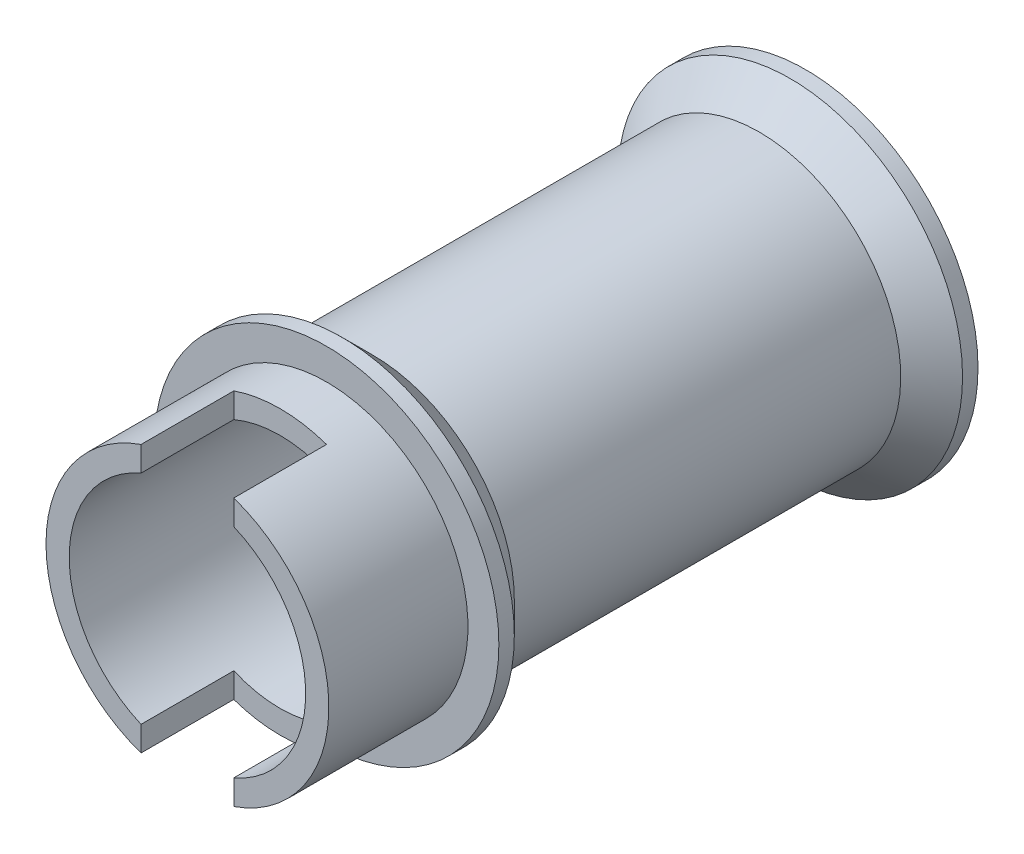
ISO-10303-21;
HEADER;
FILE_DESCRIPTION(('STEP AP214'),'2;1');
FILE_NAME('part.step','',(''),(''),'','','');
FILE_SCHEMA(('AUTOMOTIVE_DESIGN { 1 0 10303 214 1 1 1 1 }'));
ENDSEC;
DATA;
#1=APPLICATION_CONTEXT('core data for automotive mechanical design processes');
#2=APPLICATION_PROTOCOL_DEFINITION('international standard','automotive_design',2000,#1);
#3=PRODUCT_CONTEXT('',#1,'mechanical');
#4=PRODUCT('Part','Part','',(#3));
#5=PRODUCT_RELATED_PRODUCT_CATEGORY('part','',(#4));
#6=PRODUCT_DEFINITION_FORMATION('','',#4);
#7=PRODUCT_DEFINITION_CONTEXT('part definition',#1,'design');
#8=PRODUCT_DEFINITION('design','',#6,#7);
#9=PRODUCT_DEFINITION_SHAPE('','',#8);
#10=(LENGTH_UNIT() NAMED_UNIT(*) SI_UNIT(.MILLI.,.METRE.));
#11=(NAMED_UNIT(*) PLANE_ANGLE_UNIT() SI_UNIT($,.RADIAN.));
#12=(NAMED_UNIT(*) SI_UNIT($,.STERADIAN.) SOLID_ANGLE_UNIT());
#13=UNCERTAINTY_MEASURE_WITH_UNIT(LENGTH_MEASURE(1.E-05),#10,'distance_accuracy_value','');
#14=(GEOMETRIC_REPRESENTATION_CONTEXT(3) GLOBAL_UNCERTAINTY_ASSIGNED_CONTEXT((#13)) GLOBAL_UNIT_ASSIGNED_CONTEXT((#10,
#11,#12)) REPRESENTATION_CONTEXT('',''));
#15=CARTESIAN_POINT('',(0.,0.,0.));
#16=DIRECTION('',(0.,0.,1.));
#17=DIRECTION('',(1.,0.,0.));
#18=AXIS2_PLACEMENT_3D('',#15,#16,#17);
#19=CARTESIAN_POINT('',(0.,0.,40.));
#20=DIRECTION('',(0.,0.,-1.));
#21=DIRECTION('',(-1.,0.,0.));
#22=AXIS2_PLACEMENT_3D('',#19,#20,#21);
#23=CYLINDRICAL_SURFACE('',#22,9.15);
#24=DIRECTION('',(0.,0.,-1.));
#25=VECTOR('',#24,1.);
#26=CARTESIAN_POINT('',(0.499999999999999,-9.13632858428373,5.));
#27=LINE('',#26,#25);
#28=CARTESIAN_POINT('',(0.499999999999999,-9.13632858428374,2.99999999999998));
#29=VERTEX_POINT('',#28);
#30=CARTESIAN_POINT('',(0.499999999999999,-9.13632858428373,0.));
#31=VERTEX_POINT('',#30);
#32=EDGE_CURVE('E129',#29,#31,#27,.T.);
#33=ORIENTED_EDGE('',*,*,#32,.F.);
#34=CARTESIAN_POINT('',(0.,0.,3.));
#35=DIRECTION('',(0.,0.,-1.));
#36=DIRECTION('',(-1.,0.,0.));
#37=AXIS2_PLACEMENT_3D('',#34,#35,#36);
#38=CIRCLE('',#37,9.15);
#39=CARTESIAN_POINT('',(-0.500000000000001,-9.13632858428373,2.99999999999999));
#40=VERTEX_POINT('',#39);
#41=EDGE_CURVE('E247',#40,#29,#38,.T.);
#42=ORIENTED_EDGE('',*,*,#41,.F.);
#43=DIRECTION('',(0.,0.,-1.));
#44=VECTOR('',#43,1.);
#45=CARTESIAN_POINT('',(-0.500000000000001,-9.13632858428373,5.));
#46=LINE('',#45,#44);
#47=CARTESIAN_POINT('',(-0.500000000000001,-9.13632858428373,0.));
#48=VERTEX_POINT('',#47);
#49=EDGE_CURVE('E143',#40,#48,#46,.T.);
#50=ORIENTED_EDGE('',*,*,#49,.T.);
#51=CARTESIAN_POINT('',(0.,0.,0.));
#52=DIRECTION('',(0.,0.,1.));
#53=DIRECTION('',(1.,0.,0.));
#54=AXIS2_PLACEMENT_3D('',#51,#52,#53);
#55=CIRCLE('',#54,9.15);
#56=EDGE_CURVE('E141',#48,#31,#55,.T.);
#57=ORIENTED_EDGE('',*,*,#56,.T.);
#58=EDGE_LOOP('',(#33,#42,#50,#57));
#59=FACE_BOUND('',#58,.T.);
#60=CARTESIAN_POINT('',(0.,0.,28.));
#61=DIRECTION('',(0.,0.,1.));
#62=DIRECTION('',(1.,0.,0.));
#63=AXIS2_PLACEMENT_3D('',#60,#61,#62);
#64=CIRCLE('',#63,9.15);
#65=CARTESIAN_POINT('',(9.15,0.,28.));
#66=VERTEX_POINT('',#65);
#67=EDGE_CURVE('E243',#66,#66,#64,.T.);
#68=ORIENTED_EDGE('',*,*,#67,.F.);
#69=EDGE_LOOP('',(#68));
#70=FACE_BOUND('',#69,.T.);
#71=ADVANCED_FACE('F41',(#59,#70),#23,.T.);
#72=CARTESIAN_POINT('',(0.,0.,34.));
#73=DIRECTION('',(0.,0.,-1.));
#74=DIRECTION('',(-1.,0.,0.));
#75=AXIS2_PLACEMENT_3D('',#72,#73,#74);
#76=CIRCLE('',#75,9.15);
#77=CARTESIAN_POINT('',(3.,-8.64421772053435,34.));
#78=VERTEX_POINT('',#77);
#79=CARTESIAN_POINT('',(-3.,-8.64421772053435,34.));
#80=VERTEX_POINT('',#79);
#81=EDGE_CURVE('E196',#78,#80,#76,.T.);
#82=ORIENTED_EDGE('',*,*,#81,.T.);
#83=DIRECTION('',(0.,0.,-1.));
#84=VECTOR('',#83,1.);
#85=CARTESIAN_POINT('',(-3.,-8.64421772053435,40.));
#86=LINE('',#85,#84);
#87=CARTESIAN_POINT('',(-3.,-8.64421772053435,40.));
#88=VERTEX_POINT('',#87);
#89=EDGE_CURVE('E201',#80,#88,#86,.F.);
#90=ORIENTED_EDGE('',*,*,#89,.T.);
#91=CARTESIAN_POINT('',(0.,0.,40.));
#92=DIRECTION('',(0.,0.,1.));
#93=DIRECTION('',(1.,0.,0.));
#94=AXIS2_PLACEMENT_3D('',#91,#92,#93);
#95=CIRCLE('',#94,9.15);
#96=CARTESIAN_POINT('',(-3.,8.64421772053435,40.));
#97=VERTEX_POINT('',#96);
#98=EDGE_CURVE('E222',#97,#88,#95,.T.);
#99=ORIENTED_EDGE('',*,*,#98,.F.);
#100=DIRECTION('',(0.,0.,-1.));
#101=VECTOR('',#100,1.);
#102=CARTESIAN_POINT('',(-3.,8.64421772053435,40.));
#103=LINE('',#102,#101);
#104=CARTESIAN_POINT('',(-3.,8.64421772053435,34.));
#105=VERTEX_POINT('',#104);
#106=EDGE_CURVE('E205',#97,#105,#103,.T.);
#107=ORIENTED_EDGE('',*,*,#106,.T.);
#108=CARTESIAN_POINT('',(3.,8.64421772053435,34.));
#109=VERTEX_POINT('',#108);
#110=EDGE_CURVE('E200',#105,#109,#76,.T.);
#111=ORIENTED_EDGE('',*,*,#110,.T.);
#112=DIRECTION('',(0.,0.,-1.));
#113=VECTOR('',#112,1.);
#114=CARTESIAN_POINT('',(3.,8.64421772053435,40.));
#115=LINE('',#114,#113);
#116=CARTESIAN_POINT('',(3.,8.64421772053435,40.));
#117=VERTEX_POINT('',#116);
#118=EDGE_CURVE('E188',#109,#117,#115,.F.);
#119=ORIENTED_EDGE('',*,*,#118,.T.);
#120=CARTESIAN_POINT('',(3.,-8.64421772053435,40.));
#121=VERTEX_POINT('',#120);
#122=EDGE_CURVE('E218',#121,#117,#95,.T.);
#123=ORIENTED_EDGE('',*,*,#122,.F.);
#124=DIRECTION('',(0.,0.,-1.));
#125=VECTOR('',#124,1.);
#126=CARTESIAN_POINT('',(3.,-8.64421772053435,40.));
#127=LINE('',#126,#125);
#128=EDGE_CURVE('E192',#121,#78,#127,.T.);
#129=ORIENTED_EDGE('',*,*,#128,.T.);
#130=EDGE_LOOP('',(#82,#90,#99,#107,#111,#119,#123,#129));
#131=FACE_BOUND('',#130,.T.);
#132=CARTESIAN_POINT('',(0.,0.,31.));
#133=DIRECTION('',(0.,0.,-1.));
#134=DIRECTION('',(-1.,0.,0.));
#135=AXIS2_PLACEMENT_3D('',#132,#133,#134);
#136=CIRCLE('',#135,9.15);
#137=CARTESIAN_POINT('',(-9.15,0.,31.));
#138=VERTEX_POINT('',#137);
#139=EDGE_CURVE('E239',#138,#138,#136,.T.);
#140=ORIENTED_EDGE('',*,*,#139,.F.);
#141=EDGE_LOOP('',(#140));
#142=FACE_BOUND('',#141,.T.);
#143=ADVANCED_FACE('F291',(#131,#142),#23,.T.);
#144=CARTESIAN_POINT('',(0.,0.,40.));
#145=DIRECTION('',(0.,0.,1.));
#146=DIRECTION('',(1.,0.,0.));
#147=AXIS2_PLACEMENT_3D('',#144,#145,#146);
#148=PLANE('',#147);
#149=DIRECTION('',(0.,1.,0.));
#150=VECTOR('',#149,1.);
#151=CARTESIAN_POINT('',(-3.,-15.,40.));
#152=LINE('',#151,#150);
#153=CARTESIAN_POINT('',(-3.,7.03722246344394,40.));
#154=VERTEX_POINT('',#153);
#155=EDGE_CURVE('E171',#154,#97,#152,.T.);
#156=ORIENTED_EDGE('',*,*,#155,.T.);
#157=ORIENTED_EDGE('',*,*,#98,.T.);
#158=CARTESIAN_POINT('',(-3.,-7.03722246344394,40.));
#159=VERTEX_POINT('',#158);
#160=EDGE_CURVE('E184',#88,#159,#152,.T.);
#161=ORIENTED_EDGE('',*,*,#160,.T.);
#162=CARTESIAN_POINT('',(0.,0.,40.));
#163=DIRECTION('',(0.,0.,1.));
#164=DIRECTION('',(1.,0.,0.));
#165=AXIS2_PLACEMENT_3D('',#162,#163,#164);
#166=CIRCLE('',#165,7.65);
#167=EDGE_CURVE('E214',#154,#159,#166,.T.);
#168=ORIENTED_EDGE('',*,*,#167,.F.);
#169=EDGE_LOOP('',(#156,#157,#161,#168));
#170=FACE_BOUND('',#169,.T.);
#171=ADVANCED_FACE('F274',(#170),#148,.T.);
#172=DIRECTION('',(0.,1.,0.));
#173=VECTOR('',#172,1.);
#174=CARTESIAN_POINT('',(3.,-15.,40.));
#175=LINE('',#174,#173);
#176=CARTESIAN_POINT('',(3.,-7.03722246344394,40.));
#177=VERTEX_POINT('',#176);
#178=EDGE_CURVE('E180',#121,#177,#175,.T.);
#179=ORIENTED_EDGE('',*,*,#178,.F.);
#180=ORIENTED_EDGE('',*,*,#122,.T.);
#181=CARTESIAN_POINT('',(3.,7.03722246344394,40.));
#182=VERTEX_POINT('',#181);
#183=EDGE_CURVE('E181',#182,#117,#175,.T.);
#184=ORIENTED_EDGE('',*,*,#183,.F.);
#185=EDGE_CURVE('E210',#177,#182,#166,.T.);
#186=ORIENTED_EDGE('',*,*,#185,.F.);
#187=EDGE_LOOP('',(#179,#180,#184,#186));
#188=FACE_BOUND('',#187,.T.);
#189=ADVANCED_FACE('F305',(#188),#148,.T.);
#190=CARTESIAN_POINT('',(0.,0.,0.));
#191=DIRECTION('',(0.,0.,1.));
#192=DIRECTION('',(1.,0.,0.));
#193=AXIS2_PLACEMENT_3D('',#190,#191,#192);
#194=PLANE('',#193);
#195=CARTESIAN_POINT('',(0.,0.,0.));
#196=DIRECTION('',(0.,0.,1.));
#197=DIRECTION('',(1.,0.,0.));
#198=AXIS2_PLACEMENT_3D('',#195,#196,#197);
#199=CIRCLE('',#198,7.65);
#200=CARTESIAN_POINT('',(7.65,0.,0.));
#201=VERTEX_POINT('',#200);
#202=EDGE_CURVE('E209',#201,#201,#199,.T.);
#203=ORIENTED_EDGE('',*,*,#202,.T.);
#204=EDGE_LOOP('',(#203));
#205=FACE_BOUND('',#204,.T.);
#206=ORIENTED_EDGE('',*,*,#56,.F.);
#207=DIRECTION('',(0.0546448087431694,0.998505856205873,0.));
#208=VECTOR('',#207,1.);
#209=CARTESIAN_POINT('',(-0.500000000000001,-9.13632858428373,0.));
#210=LINE('',#209,#208);
#211=CARTESIAN_POINT('',(-0.60928961748634,-11.1333402966955,0.));
#212=VERTEX_POINT('',#211);
#213=EDGE_CURVE('E138',#212,#48,#210,.T.);
#214=ORIENTED_EDGE('',*,*,#213,.F.);
#215=CARTESIAN_POINT('',(0.,0.,0.));
#216=DIRECTION('',(0.,0.,-1.));
#217=DIRECTION('',(-1.,0.,0.));
#218=AXIS2_PLACEMENT_3D('',#215,#216,#217);
#219=CIRCLE('',#218,11.15);
#220=CARTESIAN_POINT('',(0.609289617486333,-11.1333402966955,0.));
#221=VERTEX_POINT('',#220);
#222=EDGE_CURVE('E152',#212,#221,#219,.T.);
#223=ORIENTED_EDGE('',*,*,#222,.T.);
#224=DIRECTION('',(0.0546448087431692,-0.998505856205873,0.));
#225=VECTOR('',#224,1.);
#226=CARTESIAN_POINT('',(0.609289617486337,-11.1333402966955,0.));
#227=LINE('',#226,#225);
#228=EDGE_CURVE('E133',#31,#221,#227,.T.);
#229=ORIENTED_EDGE('',*,*,#228,.F.);
#230=EDGE_LOOP('',(#206,#214,#223,#229));
#231=FACE_BOUND('',#230,.T.);
#232=ADVANCED_FACE('F150',(#205,#231),#194,.F.);
#233=CARTESIAN_POINT('',(0.,0.,40.));
#234=DIRECTION('',(0.,0.,-1.));
#235=DIRECTION('',(-1.,0.,0.));
#236=AXIS2_PLACEMENT_3D('',#233,#234,#235);
#237=CYLINDRICAL_SURFACE('',#236,7.65);
#238=DIRECTION('',(0.,0.,-1.));
#239=VECTOR('',#238,1.);
#240=CARTESIAN_POINT('',(-3.,-7.03722246344394,40.));
#241=LINE('',#240,#239);
#242=CARTESIAN_POINT('',(-3.,-7.03722246344394,34.));
#243=VERTEX_POINT('',#242);
#244=EDGE_CURVE('E236',#243,#159,#241,.F.);
#245=ORIENTED_EDGE('',*,*,#244,.F.);
#246=CARTESIAN_POINT('',(0.,0.,34.));
#247=DIRECTION('',(0.,0.,-1.));
#248=DIRECTION('',(-1.,0.,0.));
#249=AXIS2_PLACEMENT_3D('',#246,#247,#248);
#250=CIRCLE('',#249,7.65);
#251=CARTESIAN_POINT('',(3.,-7.03722246344394,34.));
#252=VERTEX_POINT('',#251);
#253=EDGE_CURVE('E230',#252,#243,#250,.T.);
#254=ORIENTED_EDGE('',*,*,#253,.F.);
#255=DIRECTION('',(0.,0.,-1.));
#256=VECTOR('',#255,1.);
#257=CARTESIAN_POINT('',(3.,-7.03722246344394,40.));
#258=LINE('',#257,#256);
#259=EDGE_CURVE('E233',#177,#252,#258,.T.);
#260=ORIENTED_EDGE('',*,*,#259,.F.);
#261=ORIENTED_EDGE('',*,*,#185,.T.);
#262=DIRECTION('',(0.,0.,-1.));
#263=VECTOR('',#262,1.);
#264=CARTESIAN_POINT('',(3.,7.03722246344394,40.));
#265=LINE('',#264,#263);
#266=CARTESIAN_POINT('',(3.,7.03722246344394,34.));
#267=VERTEX_POINT('',#266);
#268=EDGE_CURVE('E223',#267,#182,#265,.F.);
#269=ORIENTED_EDGE('',*,*,#268,.F.);
#270=CARTESIAN_POINT('',(-3.,7.03722246344394,34.));
#271=VERTEX_POINT('',#270);
#272=EDGE_CURVE('E226',#271,#267,#250,.T.);
#273=ORIENTED_EDGE('',*,*,#272,.F.);
#274=DIRECTION('',(0.,0.,-1.));
#275=VECTOR('',#274,1.);
#276=CARTESIAN_POINT('',(-3.,7.03722246344394,40.));
#277=LINE('',#276,#275);
#278=EDGE_CURVE('E229',#154,#271,#277,.T.);
#279=ORIENTED_EDGE('',*,*,#278,.F.);
#280=ORIENTED_EDGE('',*,*,#167,.T.);
#281=EDGE_LOOP('',(#245,#254,#260,#261,#269,#273,#279,#280));
#282=FACE_BOUND('',#281,.T.);
#283=ORIENTED_EDGE('',*,*,#202,.F.);
#284=EDGE_LOOP('',(#283));
#285=FACE_BOUND('',#284,.T.);
#286=ADVANCED_FACE('F280',(#282,#285),#237,.F.);
#287=CARTESIAN_POINT('',(3.,-15.,40.));
#288=DIRECTION('',(1.,0.,0.));
#289=DIRECTION('',(0.,0.,-1.));
#290=AXIS2_PLACEMENT_3D('',#287,#288,#289);
#291=PLANE('',#290);
#292=DIRECTION('',(0.,1.,0.));
#293=VECTOR('',#292,1.);
#294=CARTESIAN_POINT('',(3.,-15.,34.));
#295=LINE('',#294,#293);
#296=EDGE_CURVE('E66',#267,#109,#295,.T.);
#297=ORIENTED_EDGE('',*,*,#296,.F.);
#298=ORIENTED_EDGE('',*,*,#268,.T.);
#299=ORIENTED_EDGE('',*,*,#183,.T.);
#300=ORIENTED_EDGE('',*,*,#118,.F.);
#301=EDGE_LOOP('',(#297,#298,#299,#300));
#302=FACE_BOUND('',#301,.T.);
#303=ADVANCED_FACE('F306',(#302),#291,.F.);
#304=CARTESIAN_POINT('',(-3.,-15.,34.));
#305=DIRECTION('',(0.,0.,-1.));
#306=DIRECTION('',(-1.,0.,0.));
#307=AXIS2_PLACEMENT_3D('',#304,#305,#306);
#308=PLANE('',#307);
#309=DIRECTION('',(0.,1.,0.));
#310=VECTOR('',#309,1.);
#311=CARTESIAN_POINT('',(-3.,-15.,34.));
#312=LINE('',#311,#310);
#313=EDGE_CURVE('E172',#271,#105,#312,.T.);
#314=ORIENTED_EDGE('',*,*,#313,.F.);
#315=ORIENTED_EDGE('',*,*,#272,.T.);
#316=ORIENTED_EDGE('',*,*,#296,.T.);
#317=ORIENTED_EDGE('',*,*,#110,.F.);
#318=EDGE_LOOP('',(#314,#315,#316,#317));
#319=FACE_BOUND('',#318,.T.);
#320=ADVANCED_FACE('F289',(#319),#308,.F.);
#321=CARTESIAN_POINT('',(-3.,-15.,40.));
#322=DIRECTION('',(-1.,0.,0.));
#323=DIRECTION('',(0.,0.,1.));
#324=AXIS2_PLACEMENT_3D('',#321,#322,#323);
#325=PLANE('',#324);
#326=ORIENTED_EDGE('',*,*,#155,.F.);
#327=ORIENTED_EDGE('',*,*,#278,.T.);
#328=ORIENTED_EDGE('',*,*,#313,.T.);
#329=ORIENTED_EDGE('',*,*,#106,.F.);
#330=EDGE_LOOP('',(#326,#327,#328,#329));
#331=FACE_BOUND('',#330,.T.);
#332=ADVANCED_FACE('F287',(#331),#325,.F.);
#333=EDGE_CURVE('E176',#80,#243,#312,.T.);
#334=ORIENTED_EDGE('',*,*,#333,.T.);
#335=ORIENTED_EDGE('',*,*,#244,.T.);
#336=ORIENTED_EDGE('',*,*,#160,.F.);
#337=ORIENTED_EDGE('',*,*,#89,.F.);
#338=EDGE_LOOP('',(#334,#335,#336,#337));
#339=FACE_BOUND('',#338,.T.);
#340=ADVANCED_FACE('F295',(#339),#325,.F.);
#341=EDGE_CURVE('E177',#78,#252,#295,.T.);
#342=ORIENTED_EDGE('',*,*,#341,.T.);
#343=ORIENTED_EDGE('',*,*,#253,.T.);
#344=ORIENTED_EDGE('',*,*,#333,.F.);
#345=ORIENTED_EDGE('',*,*,#81,.F.);
#346=EDGE_LOOP('',(#342,#343,#344,#345));
#347=FACE_BOUND('',#346,.T.);
#348=ADVANCED_FACE('F297',(#347),#308,.F.);
#349=ORIENTED_EDGE('',*,*,#178,.T.);
#350=ORIENTED_EDGE('',*,*,#259,.T.);
#351=ORIENTED_EDGE('',*,*,#341,.F.);
#352=ORIENTED_EDGE('',*,*,#128,.F.);
#353=EDGE_LOOP('',(#349,#350,#351,#352));
#354=FACE_BOUND('',#353,.T.);
#355=ADVANCED_FACE('F309',(#354),#291,.F.);
#356=CARTESIAN_POINT('',(0.,0.,0.));
#357=DIRECTION('',(0.,0.,-1.));
#358=DIRECTION('',(-1.,0.,0.));
#359=AXIS2_PLACEMENT_3D('',#356,#357,#358);
#360=CYLINDRICAL_SURFACE('',#359,11.15);
#361=CARTESIAN_POINT('',(0.,0.,30.));
#362=DIRECTION('',(0.,0.,1.));
#363=DIRECTION('',(1.,0.,0.));
#364=AXIS2_PLACEMENT_3D('',#361,#362,#363);
#365=CIRCLE('',#364,11.15);
#366=CARTESIAN_POINT('',(11.15,0.,30.));
#367=VERTEX_POINT('',#366);
#368=EDGE_CURVE('E254',#367,#367,#365,.T.);
#369=ORIENTED_EDGE('',*,*,#368,.T.);
#370=EDGE_LOOP('',(#369));
#371=FACE_BOUND('',#370,.T.);
#372=CARTESIAN_POINT('',(0.,0.,31.));
#373=DIRECTION('',(0.,0.,-1.));
#374=DIRECTION('',(-1.,0.,0.));
#375=AXIS2_PLACEMENT_3D('',#372,#373,#374);
#376=CIRCLE('',#375,11.15);
#377=CARTESIAN_POINT('',(-11.15,0.,31.));
#378=VERTEX_POINT('',#377);
#379=EDGE_CURVE('E167',#378,#378,#376,.T.);
#380=ORIENTED_EDGE('',*,*,#379,.T.);
#381=EDGE_LOOP('',(#380));
#382=FACE_BOUND('',#381,.T.);
#383=ADVANCED_FACE('F318',(#371,#382),#360,.T.);
#384=CARTESIAN_POINT('',(9.15,0.,31.));
#385=DIRECTION('',(0.,0.,-1.));
#386=DIRECTION('',(-1.,0.,0.));
#387=AXIS2_PLACEMENT_3D('',#384,#385,#386);
#388=PLANE('',#387);
#389=ORIENTED_EDGE('',*,*,#379,.F.);
#390=EDGE_LOOP('',(#389));
#391=FACE_BOUND('',#390,.T.);
#392=ORIENTED_EDGE('',*,*,#139,.T.);
#393=EDGE_LOOP('',(#392));
#394=FACE_BOUND('',#393,.T.);
#395=ADVANCED_FACE('F339',(#391,#394),#388,.F.);
#396=CARTESIAN_POINT('',(0.,0.,0.));
#397=DIRECTION('',(0.,0.,-1.));
#398=DIRECTION('',(-1.,0.,0.));
#399=AXIS2_PLACEMENT_3D('',#396,#397,#398);
#400=CYLINDRICAL_SURFACE('',#399,11.15);
#401=ORIENTED_EDGE('',*,*,#222,.F.);
#402=DIRECTION('',(0.,0.,-1.));
#403=VECTOR('',#402,1.);
#404=CARTESIAN_POINT('',(-0.60928961748634,-11.1333402966955,5.));
#405=LINE('',#404,#403);
#406=CARTESIAN_POINT('',(-0.60928961748634,-11.1333402966955,0.999999999999993));
#407=VERTEX_POINT('',#406);
#408=EDGE_CURVE('E160',#407,#212,#405,.T.);
#409=ORIENTED_EDGE('',*,*,#408,.F.);
#410=CARTESIAN_POINT('',(0.,0.,0.999999999999993));
#411=DIRECTION('',(0.,0.,-1.));
#412=DIRECTION('',(-1.,0.,0.));
#413=AXIS2_PLACEMENT_3D('',#410,#411,#412);
#414=CIRCLE('',#413,11.15);
#415=CARTESIAN_POINT('',(0.609289617486337,-11.1333402966955,0.999999999999993));
#416=VERTEX_POINT('',#415);
#417=EDGE_CURVE('E250',#407,#416,#414,.T.);
#418=ORIENTED_EDGE('',*,*,#417,.T.);
#419=DIRECTION('',(0.,0.,-1.));
#420=VECTOR('',#419,1.);
#421=CARTESIAN_POINT('',(0.609289617486333,-11.1333402966955,5.));
#422=LINE('',#421,#420);
#423=EDGE_CURVE('E58',#416,#221,#422,.T.);
#424=ORIENTED_EDGE('',*,*,#423,.T.);
#425=EDGE_LOOP('',(#401,#409,#418,#424));
#426=FACE_BOUND('',#425,.T.);
#427=ADVANCED_FACE('F331',(#426),#400,.T.);
#428=CARTESIAN_POINT('',(0.,0.,0.999999999999993));
#429=DIRECTION('',(0.,0.,-1.));
#430=DIRECTION('',(-1.,0.,0.));
#431=AXIS2_PLACEMENT_3D('',#428,#429,#430);
#432=CONICAL_SURFACE('',#431,11.15,0.78539816339745);
#433=DIRECTION('',(0.038639714818937,0.706050261977653,0.707106781186547));
#434=VECTOR('',#433,1.);
#435=CARTESIAN_POINT('',(0.,0.,12.15));
#436=LINE('',#435,#434);
#437=EDGE_CURVE('E11',#40,#407,#436,.F.);
#438=ORIENTED_EDGE('',*,*,#437,.F.);
#439=ORIENTED_EDGE('',*,*,#41,.T.);
#440=DIRECTION('',(0.0386397148189369,-0.706050261977653,-0.707106781186547));
#441=VECTOR('',#440,1.);
#442=CARTESIAN_POINT('',(0.,0.,12.15));
#443=LINE('',#442,#441);
#444=EDGE_CURVE('E51',#416,#29,#443,.F.);
#445=ORIENTED_EDGE('',*,*,#444,.F.);
#446=ORIENTED_EDGE('',*,*,#417,.F.);
#447=EDGE_LOOP('',(#438,#439,#445,#446));
#448=FACE_BOUND('',#447,.T.);
#449=ADVANCED_FACE('F327',(#448),#432,.T.);
#450=CARTESIAN_POINT('',(0.,0.,28.));
#451=DIRECTION('',(0.,0.,1.));
#452=DIRECTION('',(1.,0.,0.));
#453=AXIS2_PLACEMENT_3D('',#450,#451,#452);
#454=CONICAL_SURFACE('',#453,9.15000000000001,0.785398163397446);
#455=ORIENTED_EDGE('',*,*,#368,.F.);
#456=EDGE_LOOP('',(#455));
#457=FACE_BOUND('',#456,.T.);
#458=ORIENTED_EDGE('',*,*,#67,.T.);
#459=EDGE_LOOP('',(#458));
#460=FACE_BOUND('',#459,.T.);
#461=ADVANCED_FACE('F44',(#457,#460),#454,.T.);
#462=CARTESIAN_POINT('',(-0.500000000000001,-9.13632858428373,5.));
#463=DIRECTION('',(-0.998505856205873,0.0546448087431694,0.));
#464=DIRECTION('',(-0.0546448087431694,-0.998505856205872,0.));
#465=AXIS2_PLACEMENT_3D('',#462,#463,#464);
#466=PLANE('',#465);
#467=ORIENTED_EDGE('',*,*,#437,.T.);
#468=ORIENTED_EDGE('',*,*,#408,.T.);
#469=ORIENTED_EDGE('',*,*,#213,.T.);
#470=ORIENTED_EDGE('',*,*,#49,.F.);
#471=EDGE_LOOP('',(#467,#468,#469,#470));
#472=FACE_BOUND('',#471,.T.);
#473=ADVANCED_FACE('F337',(#472),#466,.F.);
#474=CARTESIAN_POINT('',(0.609289617486337,-11.1333402966955,5.));
#475=DIRECTION('',(0.998505856205873,0.0546448087431692,0.));
#476=DIRECTION('',(-0.0546448087431692,0.998505856205873,0.));
#477=AXIS2_PLACEMENT_3D('',#474,#475,#476);
#478=PLANE('',#477);
#479=ORIENTED_EDGE('',*,*,#444,.T.);
#480=ORIENTED_EDGE('',*,*,#32,.T.);
#481=ORIENTED_EDGE('',*,*,#228,.T.);
#482=ORIENTED_EDGE('',*,*,#423,.F.);
#483=EDGE_LOOP('',(#479,#480,#481,#482));
#484=FACE_BOUND('',#483,.T.);
#485=ADVANCED_FACE('F131',(#484),#478,.F.);
#486=CLOSED_SHELL('',(#71,#143,#171,#189,#232,#286,#303,#320,#332,#340,#348,#355,#383,#395,#427,
#449,#461,#473,#485));
#487=MANIFOLD_SOLID_BREP('B2',#486);
#488=ADVANCED_BREP_SHAPE_REPRESENTATION('',(#18,#487),#14);
#489=SHAPE_DEFINITION_REPRESENTATION(#9,#488);
ENDSEC;
END-ISO-10303-21;
